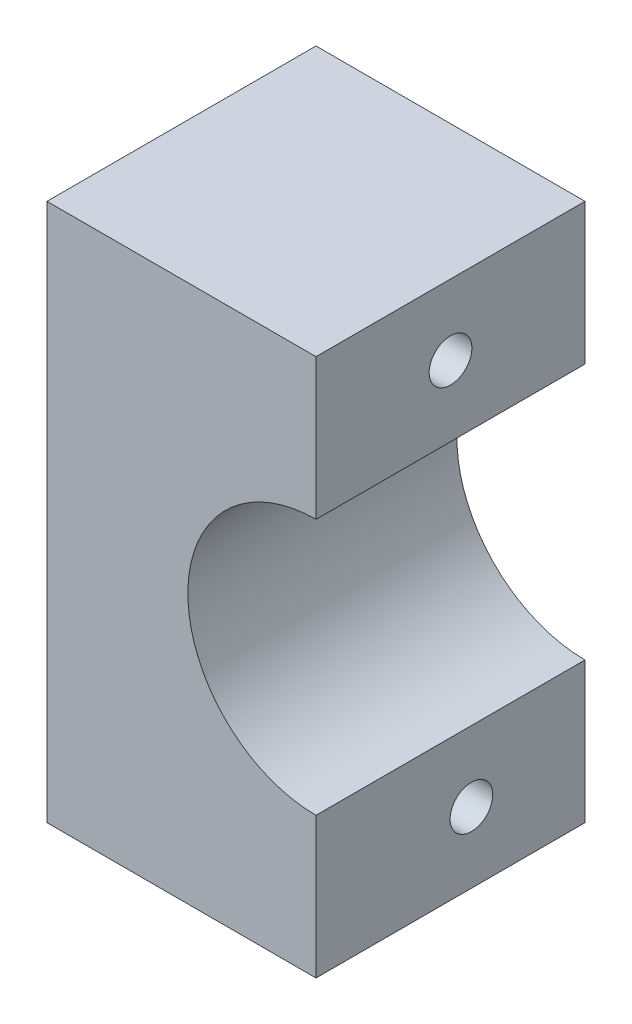
ISO-10303-21;
HEADER;
FILE_DESCRIPTION(('STEP AP214'),'2;1');
FILE_NAME('part.step','',(''),(''),'','','');
FILE_SCHEMA(('AUTOMOTIVE_DESIGN { 1 0 10303 214 1 1 1 1 }'));
ENDSEC;
DATA;
#1=APPLICATION_CONTEXT('core data for automotive mechanical design processes');
#2=APPLICATION_PROTOCOL_DEFINITION('international standard','automotive_design',2000,#1);
#3=PRODUCT_CONTEXT('',#1,'mechanical');
#4=PRODUCT('Part','Part','',(#3));
#5=PRODUCT_RELATED_PRODUCT_CATEGORY('part','',(#4));
#6=PRODUCT_DEFINITION_FORMATION('','',#4);
#7=PRODUCT_DEFINITION_CONTEXT('part definition',#1,'design');
#8=PRODUCT_DEFINITION('design','',#6,#7);
#9=PRODUCT_DEFINITION_SHAPE('','',#8);
#10=(LENGTH_UNIT() NAMED_UNIT(*) SI_UNIT(.MILLI.,.METRE.));
#11=(NAMED_UNIT(*) PLANE_ANGLE_UNIT() SI_UNIT($,.RADIAN.));
#12=(NAMED_UNIT(*) SI_UNIT($,.STERADIAN.) SOLID_ANGLE_UNIT());
#13=UNCERTAINTY_MEASURE_WITH_UNIT(LENGTH_MEASURE(1.E-05),#10,'distance_accuracy_value','');
#14=(GEOMETRIC_REPRESENTATION_CONTEXT(3) GLOBAL_UNCERTAINTY_ASSIGNED_CONTEXT((#13)) GLOBAL_UNIT_ASSIGNED_CONTEXT((#10,
#11,#12)) REPRESENTATION_CONTEXT('',''));
#15=CARTESIAN_POINT('',(0.,0.,0.));
#16=DIRECTION('',(0.,0.,1.));
#17=DIRECTION('',(1.,0.,0.));
#18=AXIS2_PLACEMENT_3D('',#15,#16,#17);
#19=CARTESIAN_POINT('',(0.,0.,10.));
#20=DIRECTION('',(0.,0.,-1.));
#21=DIRECTION('',(-1.,0.,0.));
#22=AXIS2_PLACEMENT_3D('',#19,#20,#21);
#23=CYLINDRICAL_SURFACE('',#22,4.7625);
#24=CARTESIAN_POINT('',(0.,0.,0.));
#25=DIRECTION('',(0.,0.,1.));
#26=DIRECTION('',(1.,0.,0.));
#27=AXIS2_PLACEMENT_3D('',#24,#25,#26);
#28=CIRCLE('',#27,4.7625);
#29=CARTESIAN_POINT('',(0.,4.76249999999999,0.));
#30=VERTEX_POINT('',#29);
#31=CARTESIAN_POINT('',(0.,-4.76250000000001,0.));
#32=VERTEX_POINT('',#31);
#33=EDGE_CURVE('E115',#30,#32,#28,.T.);
#34=ORIENTED_EDGE('',*,*,#33,.F.);
#35=DIRECTION('',(0.,0.,-1.));
#36=VECTOR('',#35,1.);
#37=CARTESIAN_POINT('',(0.,4.76249999999999,10.));
#38=LINE('',#37,#36);
#39=CARTESIAN_POINT('',(0.,4.76249999999999,10.));
#40=VERTEX_POINT('',#39);
#41=EDGE_CURVE('E11',#40,#30,#38,.T.);
#42=ORIENTED_EDGE('',*,*,#41,.F.);
#43=CARTESIAN_POINT('',(0.,0.,10.));
#44=DIRECTION('',(0.,0.,1.));
#45=DIRECTION('',(1.,0.,0.));
#46=AXIS2_PLACEMENT_3D('',#43,#44,#45);
#47=CIRCLE('',#46,4.7625);
#48=CARTESIAN_POINT('',(0.,-4.76250000000001,10.));
#49=VERTEX_POINT('',#48);
#50=EDGE_CURVE('E141',#40,#49,#47,.T.);
#51=ORIENTED_EDGE('',*,*,#50,.T.);
#52=DIRECTION('',(0.,0.,-1.));
#53=VECTOR('',#52,1.);
#54=CARTESIAN_POINT('',(0.,-4.76250000000001,10.));
#55=LINE('',#54,#53);
#56=EDGE_CURVE('E49',#49,#32,#55,.T.);
#57=ORIENTED_EDGE('',*,*,#56,.T.);
#58=EDGE_LOOP('',(#34,#42,#51,#57));
#59=FACE_BOUND('',#58,.T.);
#60=ADVANCED_FACE('F33',(#59),#23,.F.);
#61=CARTESIAN_POINT('',(0.,-17.5339484871634,10.));
#62=DIRECTION('',(1.,0.,0.));
#63=DIRECTION('',(0.,0.,-1.));
#64=AXIS2_PLACEMENT_3D('',#61,#62,#63);
#65=PLANE('',#64);
#66=CARTESIAN_POINT('',(0.,7.38125,5.));
#67=DIRECTION('',(1.,0.,0.));
#68=DIRECTION('',(0.,0.,-1.));
#69=AXIS2_PLACEMENT_3D('',#66,#67,#68);
#70=CIRCLE('',#69,0.79375);
#71=CARTESIAN_POINT('',(0.,7.38125,4.20625));
#72=VERTEX_POINT('',#71);
#73=EDGE_CURVE('E144',#72,#72,#70,.T.);
#74=ORIENTED_EDGE('',*,*,#73,.F.);
#75=EDGE_LOOP('',(#74));
#76=FACE_BOUND('',#75,.T.);
#77=DIRECTION('',(0.,-1.,0.));
#78=VECTOR('',#77,1.);
#79=CARTESIAN_POINT('',(0.,-17.5339484871634,0.));
#80=LINE('',#79,#78);
#81=CARTESIAN_POINT('',(0.,10.,0.));
#82=VERTEX_POINT('',#81);
#83=EDGE_CURVE('E117',#82,#30,#80,.T.);
#84=ORIENTED_EDGE('',*,*,#83,.F.);
#85=DIRECTION('',(0.,0.,-1.));
#86=VECTOR('',#85,1.);
#87=CARTESIAN_POINT('',(0.,10.,10.));
#88=LINE('',#87,#86);
#89=CARTESIAN_POINT('',(0.,10.,10.));
#90=VERTEX_POINT('',#89);
#91=EDGE_CURVE('E41',#90,#82,#88,.T.);
#92=ORIENTED_EDGE('',*,*,#91,.F.);
#93=DIRECTION('',(0.,-1.,0.));
#94=VECTOR('',#93,1.);
#95=CARTESIAN_POINT('',(0.,-17.5339484871634,10.));
#96=LINE('',#95,#94);
#97=EDGE_CURVE('E112',#90,#40,#96,.T.);
#98=ORIENTED_EDGE('',*,*,#97,.T.);
#99=ORIENTED_EDGE('',*,*,#41,.T.);
#100=EDGE_LOOP('',(#84,#92,#98,#99));
#101=FACE_BOUND('',#100,.T.);
#102=ADVANCED_FACE('F138',(#76,#101),#65,.T.);
#103=CARTESIAN_POINT('',(-5.00000000000001,10.,10.));
#104=DIRECTION('',(0.,-1.,0.));
#105=DIRECTION('',(1.,0.,0.));
#106=AXIS2_PLACEMENT_3D('',#103,#104,#105);
#107=PLANE('',#106);
#108=DIRECTION('',(-1.,0.,0.));
#109=VECTOR('',#108,1.);
#110=CARTESIAN_POINT('',(-5.00000000000001,10.,0.));
#111=LINE('',#110,#109);
#112=CARTESIAN_POINT('',(-10.,10.,0.));
#113=VERTEX_POINT('',#112);
#114=EDGE_CURVE('E121',#82,#113,#111,.T.);
#115=ORIENTED_EDGE('',*,*,#114,.T.);
#116=DIRECTION('',(0.,0.,-1.));
#117=VECTOR('',#116,1.);
#118=CARTESIAN_POINT('',(-10.,10.,10.));
#119=LINE('',#118,#117);
#120=CARTESIAN_POINT('',(-10.,10.,10.));
#121=VERTEX_POINT('',#120);
#122=EDGE_CURVE('E96',#121,#113,#119,.T.);
#123=ORIENTED_EDGE('',*,*,#122,.F.);
#124=DIRECTION('',(-1.,0.,0.));
#125=VECTOR('',#124,1.);
#126=CARTESIAN_POINT('',(-5.00000000000001,10.,10.));
#127=LINE('',#126,#125);
#128=EDGE_CURVE('E105',#90,#121,#127,.T.);
#129=ORIENTED_EDGE('',*,*,#128,.F.);
#130=ORIENTED_EDGE('',*,*,#91,.T.);
#131=EDGE_LOOP('',(#115,#123,#129,#130));
#132=FACE_BOUND('',#131,.T.);
#133=ADVANCED_FACE('F132',(#132),#107,.F.);
#134=CARTESIAN_POINT('',(-10.,-17.5339484871634,10.));
#135=DIRECTION('',(-1.,0.,0.));
#136=DIRECTION('',(0.,0.,1.));
#137=AXIS2_PLACEMENT_3D('',#134,#135,#136);
#138=PLANE('',#137);
#139=CARTESIAN_POINT('',(-10.,-7.38125,4.2229224780572));
#140=DIRECTION('',(1.,0.,0.));
#141=DIRECTION('',(0.,0.,-1.));
#142=AXIS2_PLACEMENT_3D('',#139,#140,#141);
#143=CIRCLE('',#142,0.79375);
#144=CARTESIAN_POINT('',(-10.,-7.38125,3.4291724780572));
#145=VERTEX_POINT('',#144);
#146=EDGE_CURVE('E147',#145,#145,#143,.T.);
#147=ORIENTED_EDGE('',*,*,#146,.T.);
#148=EDGE_LOOP('',(#147));
#149=FACE_BOUND('',#148,.T.);
#150=CARTESIAN_POINT('',(-10.,7.38125,5.));
#151=DIRECTION('',(1.,0.,0.));
#152=DIRECTION('',(0.,0.,-1.));
#153=AXIS2_PLACEMENT_3D('',#150,#151,#152);
#154=CIRCLE('',#153,0.79375);
#155=CARTESIAN_POINT('',(-10.,7.38125,4.20625));
#156=VERTEX_POINT('',#155);
#157=EDGE_CURVE('E118',#156,#156,#154,.T.);
#158=ORIENTED_EDGE('',*,*,#157,.T.);
#159=EDGE_LOOP('',(#158));
#160=FACE_BOUND('',#159,.T.);
#161=DIRECTION('',(0.,1.,0.));
#162=VECTOR('',#161,1.);
#163=CARTESIAN_POINT('',(-10.,-17.5339484871634,0.));
#164=LINE('',#163,#162);
#165=CARTESIAN_POINT('',(-10.,-9.99999999999999,0.));
#166=VERTEX_POINT('',#165);
#167=EDGE_CURVE('E92',#166,#113,#164,.T.);
#168=ORIENTED_EDGE('',*,*,#167,.F.);
#169=DIRECTION('',(0.,0.,-1.));
#170=VECTOR('',#169,1.);
#171=CARTESIAN_POINT('',(-10.,-9.99999999999999,10.));
#172=LINE('',#171,#170);
#173=CARTESIAN_POINT('',(-10.,-9.99999999999999,10.));
#174=VERTEX_POINT('',#173);
#175=EDGE_CURVE('E87',#174,#166,#172,.T.);
#176=ORIENTED_EDGE('',*,*,#175,.F.);
#177=DIRECTION('',(0.,1.,0.));
#178=VECTOR('',#177,1.);
#179=CARTESIAN_POINT('',(-10.,-17.5339484871634,10.));
#180=LINE('',#179,#178);
#181=EDGE_CURVE('E90',#174,#121,#180,.T.);
#182=ORIENTED_EDGE('',*,*,#181,.T.);
#183=ORIENTED_EDGE('',*,*,#122,.T.);
#184=EDGE_LOOP('',(#168,#176,#182,#183));
#185=FACE_BOUND('',#184,.T.);
#186=ADVANCED_FACE('F89',(#149,#160,#185),#138,.T.);
#187=CARTESIAN_POINT('',(-5.00000000000001,-9.99999999999999,10.));
#188=DIRECTION('',(0.,-1.,0.));
#189=DIRECTION('',(1.,0.,0.));
#190=AXIS2_PLACEMENT_3D('',#187,#188,#189);
#191=PLANE('',#190);
#192=DIRECTION('',(-1.,0.,0.));
#193=VECTOR('',#192,1.);
#194=CARTESIAN_POINT('',(-5.00000000000001,-9.99999999999999,0.));
#195=LINE('',#194,#193);
#196=CARTESIAN_POINT('',(0.,-9.99999999999999,0.));
#197=VERTEX_POINT('',#196);
#198=EDGE_CURVE('E126',#197,#166,#195,.T.);
#199=ORIENTED_EDGE('',*,*,#198,.F.);
#200=DIRECTION('',(0.,0.,-1.));
#201=VECTOR('',#200,1.);
#202=CARTESIAN_POINT('',(0.,-9.99999999999999,10.));
#203=LINE('',#202,#201);
#204=CARTESIAN_POINT('',(0.,-9.99999999999999,10.));
#205=VERTEX_POINT('',#204);
#206=EDGE_CURVE('E68',#205,#197,#203,.T.);
#207=ORIENTED_EDGE('',*,*,#206,.F.);
#208=DIRECTION('',(-1.,0.,0.));
#209=VECTOR('',#208,1.);
#210=CARTESIAN_POINT('',(-5.00000000000001,-9.99999999999999,10.));
#211=LINE('',#210,#209);
#212=EDGE_CURVE('E102',#205,#174,#211,.T.);
#213=ORIENTED_EDGE('',*,*,#212,.T.);
#214=ORIENTED_EDGE('',*,*,#175,.T.);
#215=EDGE_LOOP('',(#199,#207,#213,#214));
#216=FACE_BOUND('',#215,.T.);
#217=ADVANCED_FACE('F108',(#216),#191,.T.);
#218=CARTESIAN_POINT('',(0.,-7.38125,4.2229224780572));
#219=DIRECTION('',(1.,0.,0.));
#220=DIRECTION('',(0.,0.,-1.));
#221=AXIS2_PLACEMENT_3D('',#218,#219,#220);
#222=CIRCLE('',#221,0.79375);
#223=CARTESIAN_POINT('',(0.,-7.38125,3.4291724780572));
#224=VERTEX_POINT('',#223);
#225=EDGE_CURVE('E150',#224,#224,#222,.T.);
#226=ORIENTED_EDGE('',*,*,#225,.F.);
#227=EDGE_LOOP('',(#226));
#228=FACE_BOUND('',#227,.T.);
#229=EDGE_CURVE('E122',#32,#197,#80,.T.);
#230=ORIENTED_EDGE('',*,*,#229,.F.);
#231=ORIENTED_EDGE('',*,*,#56,.F.);
#232=EDGE_CURVE('E109',#49,#205,#96,.T.);
#233=ORIENTED_EDGE('',*,*,#232,.T.);
#234=ORIENTED_EDGE('',*,*,#206,.T.);
#235=EDGE_LOOP('',(#230,#231,#233,#234));
#236=FACE_BOUND('',#235,.T.);
#237=ADVANCED_FACE('F140',(#228,#236),#65,.T.);
#238=CARTESIAN_POINT('',(-5.00000000000001,-17.5339484871634,10.));
#239=DIRECTION('',(0.,0.,1.));
#240=DIRECTION('',(1.,0.,0.));
#241=AXIS2_PLACEMENT_3D('',#238,#239,#240);
#242=PLANE('',#241);
#243=ORIENTED_EDGE('',*,*,#50,.F.);
#244=ORIENTED_EDGE('',*,*,#97,.F.);
#245=ORIENTED_EDGE('',*,*,#128,.T.);
#246=ORIENTED_EDGE('',*,*,#181,.F.);
#247=ORIENTED_EDGE('',*,*,#212,.F.);
#248=ORIENTED_EDGE('',*,*,#232,.F.);
#249=EDGE_LOOP('',(#243,#244,#245,#246,#247,#248));
#250=FACE_BOUND('',#249,.T.);
#251=ADVANCED_FACE('F100',(#250),#242,.T.);
#252=CARTESIAN_POINT('',(-5.00000000000001,-17.5339484871634,0.));
#253=DIRECTION('',(0.,0.,1.));
#254=DIRECTION('',(1.,0.,0.));
#255=AXIS2_PLACEMENT_3D('',#252,#253,#254);
#256=PLANE('',#255);
#257=ORIENTED_EDGE('',*,*,#33,.T.);
#258=ORIENTED_EDGE('',*,*,#229,.T.);
#259=ORIENTED_EDGE('',*,*,#198,.T.);
#260=ORIENTED_EDGE('',*,*,#167,.T.);
#261=ORIENTED_EDGE('',*,*,#114,.F.);
#262=ORIENTED_EDGE('',*,*,#83,.T.);
#263=EDGE_LOOP('',(#257,#258,#259,#260,#261,#262));
#264=FACE_BOUND('',#263,.T.);
#265=ADVANCED_FACE('F137',(#264),#256,.F.);
#266=CARTESIAN_POINT('',(-10.,7.38125,5.));
#267=DIRECTION('',(1.,0.,0.));
#268=DIRECTION('',(0.,0.,-1.));
#269=AXIS2_PLACEMENT_3D('',#266,#267,#268);
#270=CYLINDRICAL_SURFACE('',#269,0.79375);
#271=ORIENTED_EDGE('',*,*,#157,.F.);
#272=EDGE_LOOP('',(#271));
#273=FACE_BOUND('',#272,.T.);
#274=ORIENTED_EDGE('',*,*,#73,.T.);
#275=EDGE_LOOP('',(#274));
#276=FACE_BOUND('',#275,.T.);
#277=ADVANCED_FACE('F161',(#273,#276),#270,.F.);
#278=CARTESIAN_POINT('',(-10.,-7.38125,4.2229224780572));
#279=DIRECTION('',(1.,0.,0.));
#280=DIRECTION('',(0.,0.,-1.));
#281=AXIS2_PLACEMENT_3D('',#278,#279,#280);
#282=CYLINDRICAL_SURFACE('',#281,0.79375);
#283=ORIENTED_EDGE('',*,*,#146,.F.);
#284=EDGE_LOOP('',(#283));
#285=FACE_BOUND('',#284,.T.);
#286=ORIENTED_EDGE('',*,*,#225,.T.);
#287=EDGE_LOOP('',(#286));
#288=FACE_BOUND('',#287,.T.);
#289=ADVANCED_FACE('F158',(#285,#288),#282,.F.);
#290=CLOSED_SHELL('',(#60,#102,#133,#186,#217,#237,#251,#265,#277,#289));
#291=MANIFOLD_SOLID_BREP('B2',#290);
#292=ADVANCED_BREP_SHAPE_REPRESENTATION('',(#18,#291),#14);
#293=SHAPE_DEFINITION_REPRESENTATION(#9,#292);
ENDSEC;
END-ISO-10303-21;
